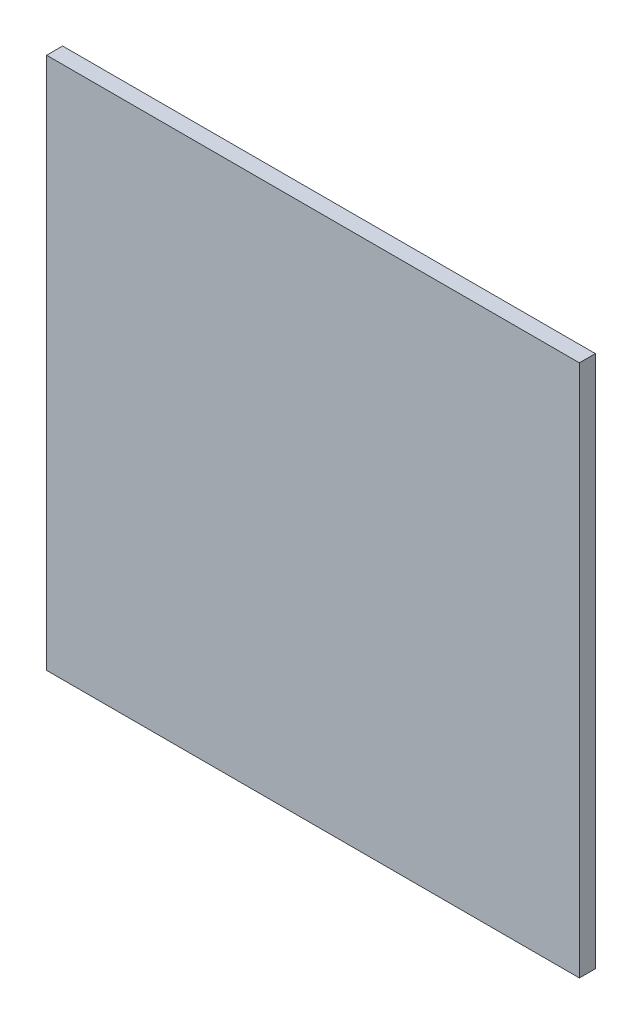
ISO-10303-21;
HEADER;
FILE_DESCRIPTION(('STEP AP214'),'2;1');
FILE_NAME('part.step','',(''),(''),'','','');
FILE_SCHEMA(('AUTOMOTIVE_DESIGN { 1 0 10303 214 1 1 1 1 }'));
ENDSEC;
DATA;
#1=APPLICATION_CONTEXT('core data for automotive mechanical design processes');
#2=APPLICATION_PROTOCOL_DEFINITION('international standard','automotive_design',2000,#1);
#3=PRODUCT_CONTEXT('',#1,'mechanical');
#4=PRODUCT('Part','Part','',(#3));
#5=PRODUCT_RELATED_PRODUCT_CATEGORY('part','',(#4));
#6=PRODUCT_DEFINITION_FORMATION('','',#4);
#7=PRODUCT_DEFINITION_CONTEXT('part definition',#1,'design');
#8=PRODUCT_DEFINITION('design','',#6,#7);
#9=PRODUCT_DEFINITION_SHAPE('','',#8);
#10=(LENGTH_UNIT() NAMED_UNIT(*) SI_UNIT(.MILLI.,.METRE.));
#11=(NAMED_UNIT(*) PLANE_ANGLE_UNIT() SI_UNIT($,.RADIAN.));
#12=(NAMED_UNIT(*) SI_UNIT($,.STERADIAN.) SOLID_ANGLE_UNIT());
#13=UNCERTAINTY_MEASURE_WITH_UNIT(LENGTH_MEASURE(1.E-05),#10,'distance_accuracy_value','');
#14=(GEOMETRIC_REPRESENTATION_CONTEXT(3) GLOBAL_UNCERTAINTY_ASSIGNED_CONTEXT((#13)) GLOBAL_UNIT_ASSIGNED_CONTEXT((#10,
#11,#12)) REPRESENTATION_CONTEXT('',''));
#15=CARTESIAN_POINT('',(0.,0.,0.));
#16=DIRECTION('',(0.,0.,1.));
#17=DIRECTION('',(1.,0.,0.));
#18=AXIS2_PLACEMENT_3D('',#15,#16,#17);
#19=CARTESIAN_POINT('',(50.,-50.,3.));
#20=DIRECTION('',(-1.,0.,0.));
#21=DIRECTION('',(0.,0.,1.));
#22=AXIS2_PLACEMENT_3D('',#19,#20,#21);
#23=PLANE('',#22);
#24=DIRECTION('',(0.,1.,0.));
#25=VECTOR('',#24,1.);
#26=CARTESIAN_POINT('',(50.,-50.,0.));
#27=LINE('',#26,#25);
#28=CARTESIAN_POINT('',(50.,-50.,0.));
#29=VERTEX_POINT('',#28);
#30=CARTESIAN_POINT('',(50.,50.,0.));
#31=VERTEX_POINT('',#30);
#32=EDGE_CURVE('E113',#29,#31,#27,.T.);
#33=ORIENTED_EDGE('',*,*,#32,.T.);
#34=DIRECTION('',(0.,0.,-1.));
#35=VECTOR('',#34,1.);
#36=CARTESIAN_POINT('',(50.,50.,3.));
#37=LINE('',#36,#35);
#38=CARTESIAN_POINT('',(50.,50.,3.));
#39=VERTEX_POINT('',#38);
#40=EDGE_CURVE('E11',#39,#31,#37,.T.);
#41=ORIENTED_EDGE('',*,*,#40,.F.);
#42=DIRECTION('',(0.,1.,0.));
#43=VECTOR('',#42,1.);
#44=CARTESIAN_POINT('',(50.,-50.,3.));
#45=LINE('',#44,#43);
#46=CARTESIAN_POINT('',(50.,-50.,3.));
#47=VERTEX_POINT('',#46);
#48=EDGE_CURVE('E98',#47,#39,#45,.T.);
#49=ORIENTED_EDGE('',*,*,#48,.F.);
#50=DIRECTION('',(0.,0.,-1.));
#51=VECTOR('',#50,1.);
#52=CARTESIAN_POINT('',(50.,-50.,3.));
#53=LINE('',#52,#51);
#54=EDGE_CURVE('E112',#47,#29,#53,.T.);
#55=ORIENTED_EDGE('',*,*,#54,.T.);
#56=EDGE_LOOP('',(#33,#41,#49,#55));
#57=FACE_BOUND('',#56,.T.);
#58=ADVANCED_FACE('F50',(#57),#23,.F.);
#59=CARTESIAN_POINT('',(-50.,50.,3.));
#60=DIRECTION('',(0.,-1.,0.));
#61=DIRECTION('',(0.,0.,-1.));
#62=AXIS2_PLACEMENT_3D('',#59,#60,#61);
#63=PLANE('',#62);
#64=DIRECTION('',(-1.,0.,0.));
#65=VECTOR('',#64,1.);
#66=CARTESIAN_POINT('',(-50.,50.,0.));
#67=LINE('',#66,#65);
#68=CARTESIAN_POINT('',(-50.,50.,0.));
#69=VERTEX_POINT('',#68);
#70=EDGE_CURVE('E101',#31,#69,#67,.T.);
#71=ORIENTED_EDGE('',*,*,#70,.T.);
#72=DIRECTION('',(0.,0.,-1.));
#73=VECTOR('',#72,1.);
#74=CARTESIAN_POINT('',(-50.,50.,3.));
#75=LINE('',#74,#73);
#76=CARTESIAN_POINT('',(-50.,50.,3.));
#77=VERTEX_POINT('',#76);
#78=EDGE_CURVE('E57',#77,#69,#75,.T.);
#79=ORIENTED_EDGE('',*,*,#78,.F.);
#80=DIRECTION('',(-1.,0.,0.));
#81=VECTOR('',#80,1.);
#82=CARTESIAN_POINT('',(-50.,50.,3.));
#83=LINE('',#82,#81);
#84=EDGE_CURVE('E92',#39,#77,#83,.T.);
#85=ORIENTED_EDGE('',*,*,#84,.F.);
#86=ORIENTED_EDGE('',*,*,#40,.T.);
#87=EDGE_LOOP('',(#71,#79,#85,#86));
#88=FACE_BOUND('',#87,.T.);
#89=ADVANCED_FACE('F104',(#88),#63,.F.);
#90=CARTESIAN_POINT('',(-50.,-50.,3.));
#91=DIRECTION('',(1.,0.,0.));
#92=DIRECTION('',(0.,0.,-1.));
#93=AXIS2_PLACEMENT_3D('',#90,#91,#92);
#94=PLANE('',#93);
#95=DIRECTION('',(0.,-1.,0.));
#96=VECTOR('',#95,1.);
#97=CARTESIAN_POINT('',(-50.,-50.,0.));
#98=LINE('',#97,#96);
#99=CARTESIAN_POINT('',(-50.,-50.,0.));
#100=VERTEX_POINT('',#99);
#101=EDGE_CURVE('E83',#69,#100,#98,.T.);
#102=ORIENTED_EDGE('',*,*,#101,.T.);
#103=DIRECTION('',(0.,0.,-1.));
#104=VECTOR('',#103,1.);
#105=CARTESIAN_POINT('',(-50.,-50.,3.));
#106=LINE('',#105,#104);
#107=CARTESIAN_POINT('',(-50.,-50.,3.));
#108=VERTEX_POINT('',#107);
#109=EDGE_CURVE('E106',#108,#100,#106,.T.);
#110=ORIENTED_EDGE('',*,*,#109,.F.);
#111=DIRECTION('',(0.,-1.,0.));
#112=VECTOR('',#111,1.);
#113=CARTESIAN_POINT('',(-50.,-50.,3.));
#114=LINE('',#113,#112);
#115=EDGE_CURVE('E100',#77,#108,#114,.T.);
#116=ORIENTED_EDGE('',*,*,#115,.F.);
#117=ORIENTED_EDGE('',*,*,#78,.T.);
#118=EDGE_LOOP('',(#102,#110,#116,#117));
#119=FACE_BOUND('',#118,.T.);
#120=ADVANCED_FACE('F107',(#119),#94,.F.);
#121=CARTESIAN_POINT('',(-50.,-50.,3.));
#122=DIRECTION('',(0.,1.,0.));
#123=DIRECTION('',(0.,0.,1.));
#124=AXIS2_PLACEMENT_3D('',#121,#122,#123);
#125=PLANE('',#124);
#126=DIRECTION('',(1.,0.,0.));
#127=VECTOR('',#126,1.);
#128=CARTESIAN_POINT('',(-50.,-50.,0.));
#129=LINE('',#128,#127);
#130=EDGE_CURVE('E90',#100,#29,#129,.T.);
#131=ORIENTED_EDGE('',*,*,#130,.T.);
#132=ORIENTED_EDGE('',*,*,#54,.F.);
#133=DIRECTION('',(1.,0.,0.));
#134=VECTOR('',#133,1.);
#135=CARTESIAN_POINT('',(-50.,-50.,3.));
#136=LINE('',#135,#134);
#137=EDGE_CURVE('E63',#108,#47,#136,.T.);
#138=ORIENTED_EDGE('',*,*,#137,.F.);
#139=ORIENTED_EDGE('',*,*,#109,.T.);
#140=EDGE_LOOP('',(#131,#132,#138,#139));
#141=FACE_BOUND('',#140,.T.);
#142=ADVANCED_FACE('F126',(#141),#125,.F.);
#143=CARTESIAN_POINT('',(0.,0.,3.));
#144=DIRECTION('',(0.,0.,-1.));
#145=DIRECTION('',(-1.,0.,0.));
#146=AXIS2_PLACEMENT_3D('',#143,#144,#145);
#147=PLANE('',#146);
#148=ORIENTED_EDGE('',*,*,#48,.T.);
#149=ORIENTED_EDGE('',*,*,#84,.T.);
#150=ORIENTED_EDGE('',*,*,#115,.T.);
#151=ORIENTED_EDGE('',*,*,#137,.T.);
#152=EDGE_LOOP('',(#148,#149,#150,#151));
#153=FACE_BOUND('',#152,.T.);
#154=ADVANCED_FACE('F94',(#153),#147,.F.);
#155=CARTESIAN_POINT('',(0.,0.,0.));
#156=DIRECTION('',(0.,0.,-1.));
#157=DIRECTION('',(-1.,0.,0.));
#158=AXIS2_PLACEMENT_3D('',#155,#156,#157);
#159=PLANE('',#158);
#160=ORIENTED_EDGE('',*,*,#32,.F.);
#161=ORIENTED_EDGE('',*,*,#130,.F.);
#162=ORIENTED_EDGE('',*,*,#101,.F.);
#163=ORIENTED_EDGE('',*,*,#70,.F.);
#164=EDGE_LOOP('',(#160,#161,#162,#163));
#165=FACE_BOUND('',#164,.T.);
#166=ADVANCED_FACE('F131',(#165),#159,.T.);
#167=CLOSED_SHELL('',(#58,#89,#120,#142,#154,#166));
#168=MANIFOLD_SOLID_BREP('B2',#167);
#169=ADVANCED_BREP_SHAPE_REPRESENTATION('',(#18,#168),#14);
#170=SHAPE_DEFINITION_REPRESENTATION(#9,#169);
ENDSEC;
END-ISO-10303-21;
